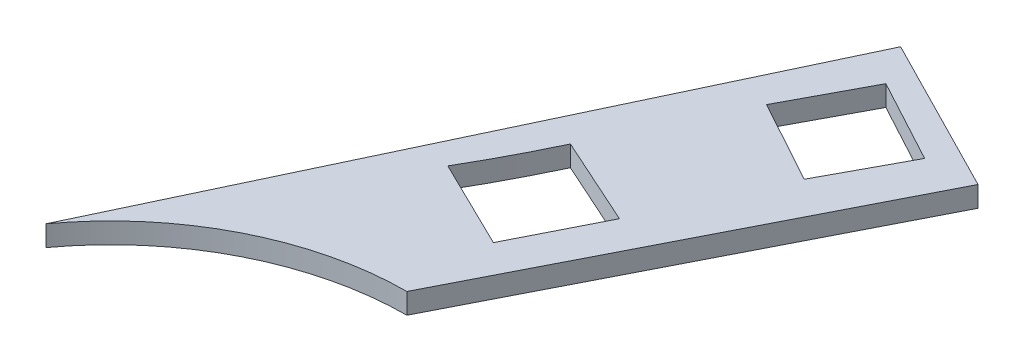
ISO-10303-21;
HEADER;
FILE_DESCRIPTION(('STEP AP214'),'2;1');
FILE_NAME('part.step','',(''),(''),'','','');
FILE_SCHEMA(('AUTOMOTIVE_DESIGN { 1 0 10303 214 1 1 1 1 }'));
ENDSEC;
DATA;
#1=APPLICATION_CONTEXT('core data for automotive mechanical design processes');
#2=APPLICATION_PROTOCOL_DEFINITION('international standard','automotive_design',2000,#1);
#3=PRODUCT_CONTEXT('',#1,'mechanical');
#4=PRODUCT('Part','Part','',(#3));
#5=PRODUCT_RELATED_PRODUCT_CATEGORY('part','',(#4));
#6=PRODUCT_DEFINITION_FORMATION('','',#4);
#7=PRODUCT_DEFINITION_CONTEXT('part definition',#1,'design');
#8=PRODUCT_DEFINITION('design','',#6,#7);
#9=PRODUCT_DEFINITION_SHAPE('','',#8);
#10=(LENGTH_UNIT() NAMED_UNIT(*) SI_UNIT(.MILLI.,.METRE.));
#11=(NAMED_UNIT(*) PLANE_ANGLE_UNIT() SI_UNIT($,.RADIAN.));
#12=(NAMED_UNIT(*) SI_UNIT($,.STERADIAN.) SOLID_ANGLE_UNIT());
#13=UNCERTAINTY_MEASURE_WITH_UNIT(LENGTH_MEASURE(1.E-05),#10,'distance_accuracy_value','');
#14=(GEOMETRIC_REPRESENTATION_CONTEXT(3) GLOBAL_UNCERTAINTY_ASSIGNED_CONTEXT((#13)) GLOBAL_UNIT_ASSIGNED_CONTEXT((#10,
#11,#12)) REPRESENTATION_CONTEXT('',''));
#15=CARTESIAN_POINT('',(0.,0.,0.));
#16=DIRECTION('',(0.,0.,1.));
#17=DIRECTION('',(1.,0.,0.));
#18=AXIS2_PLACEMENT_3D('',#15,#16,#17);
#19=CARTESIAN_POINT('',(-62.8289047130885,37.9982295849911,9.03251717554951));
#20=DIRECTION('',(0.,1.,0.));
#21=DIRECTION('',(0.,0.,1.));
#22=AXIS2_PLACEMENT_3D('',#19,#20,#21);
#23=CYLINDRICAL_SURFACE('',#22,40.1816629868308);
#24=DIRECTION('',(0.,1.,0.));
#25=VECTOR('',#24,1.);
#26=CARTESIAN_POINT('',(-62.9348275238655,37.9982295849911,-31.1490061995717));
#27=LINE('',#26,#25);
#28=CARTESIAN_POINT('',(-62.9348275238655,37.9982295849911,-31.1490061995717));
#29=VERTEX_POINT('',#28);
#30=CARTESIAN_POINT('',(-62.9348275238655,40.7893212700929,-31.1490061995717));
#31=VERTEX_POINT('',#30);
#32=EDGE_CURVE('E45',#29,#31,#27,.T.);
#33=ORIENTED_EDGE('',*,*,#32,.T.);
#34=CARTESIAN_POINT('',(-62.8289047130885,40.7893212700929,9.03251717554951));
#35=DIRECTION('',(0.,-1.,0.));
#36=DIRECTION('',(0.,0.,1.));
#37=AXIS2_PLACEMENT_3D('',#34,#35,#36);
#38=CIRCLE('',#37,40.1816629868308);
#39=CARTESIAN_POINT('',(-95.2854857466239,40.7893212700929,-14.6558003670875));
#40=VERTEX_POINT('',#39);
#41=EDGE_CURVE('E187',#40,#31,#38,.T.);
#42=ORIENTED_EDGE('',*,*,#41,.F.);
#43=DIRECTION('',(0.,1.,0.));
#44=VECTOR('',#43,1.);
#45=CARTESIAN_POINT('',(-95.2854857466239,37.9982295849911,-14.6558003670875));
#46=LINE('',#45,#44);
#47=CARTESIAN_POINT('',(-95.2854857466239,37.9982295849911,-14.6558003670875));
#48=VERTEX_POINT('',#47);
#49=EDGE_CURVE('E11',#48,#40,#46,.T.);
#50=ORIENTED_EDGE('',*,*,#49,.F.);
#51=CARTESIAN_POINT('',(-62.8289047130885,37.9982295849911,9.03251717554951));
#52=DIRECTION('',(0.,-1.,0.));
#53=DIRECTION('',(0.,0.,1.));
#54=AXIS2_PLACEMENT_3D('',#51,#52,#53);
#55=CIRCLE('',#54,40.1816629868308);
#56=EDGE_CURVE('E209',#48,#29,#55,.T.);
#57=ORIENTED_EDGE('',*,*,#56,.T.);
#58=EDGE_LOOP('',(#33,#42,#50,#57));
#59=FACE_BOUND('',#58,.T.);
#60=ADVANCED_FACE('F39',(#59),#23,.F.);
#61=CARTESIAN_POINT('',(-58.2065337706969,37.9982295849911,-93.2394391329269));
#62=DIRECTION('',(-0.904381861962965,0.,-0.426724088554186));
#63=DIRECTION('',(-0.426724088554186,0.,0.904381861962965));
#64=AXIS2_PLACEMENT_3D('',#61,#62,#63);
#65=PLANE('',#64);
#66=ORIENTED_EDGE('',*,*,#49,.T.);
#67=DIRECTION('',(-0.426724088554186,0.,0.904381861962965));
#68=VECTOR('',#67,1.);
#69=CARTESIAN_POINT('',(-58.2065337706969,40.7893212700929,-93.2394391329269));
#70=LINE('',#69,#68);
#71=CARTESIAN_POINT('',(-58.2065337706969,40.7893212700929,-93.2394391329269));
#72=VERTEX_POINT('',#71);
#73=EDGE_CURVE('E204',#72,#40,#70,.T.);
#74=ORIENTED_EDGE('',*,*,#73,.F.);
#75=DIRECTION('',(0.,1.,0.));
#76=VECTOR('',#75,1.);
#77=CARTESIAN_POINT('',(-58.2065337706969,37.9982295849911,-93.2394391329269));
#78=LINE('',#77,#76);
#79=CARTESIAN_POINT('',(-58.2065337706969,37.9982295849911,-93.2394391329269));
#80=VERTEX_POINT('',#79);
#81=EDGE_CURVE('E50',#80,#72,#78,.T.);
#82=ORIENTED_EDGE('',*,*,#81,.F.);
#83=DIRECTION('',(-0.426724088554186,0.,0.904381861962965));
#84=VECTOR('',#83,1.);
#85=CARTESIAN_POINT('',(-58.2065337706969,37.9982295849911,-93.2394391329269));
#86=LINE('',#85,#84);
#87=EDGE_CURVE('E220',#80,#48,#86,.T.);
#88=ORIENTED_EDGE('',*,*,#87,.T.);
#89=EDGE_LOOP('',(#66,#74,#82,#88));
#90=FACE_BOUND('',#89,.T.);
#91=ADVANCED_FACE('F231',(#90),#65,.T.);
#92=CARTESIAN_POINT('',(-36.8270195982419,37.9982295849911,-82.3345606948243));
#93=DIRECTION('',(0.45436993492094,0.,-0.89081309051896));
#94=DIRECTION('',(-0.89081309051896,0.,-0.454369934920939));
#95=AXIS2_PLACEMENT_3D('',#92,#93,#94);
#96=PLANE('',#95);
#97=ORIENTED_EDGE('',*,*,#81,.T.);
#98=DIRECTION('',(-0.89081309051896,0.,-0.454369934920939));
#99=VECTOR('',#98,1.);
#100=CARTESIAN_POINT('',(-36.8270195982419,40.7893212700929,-82.3345606948243));
#101=LINE('',#100,#99);
#102=CARTESIAN_POINT('',(-36.8270195982419,40.7893212700929,-82.3345606948243));
#103=VERTEX_POINT('',#102);
#104=EDGE_CURVE('E205',#103,#72,#101,.T.);
#105=ORIENTED_EDGE('',*,*,#104,.F.);
#106=DIRECTION('',(0.,1.,0.));
#107=VECTOR('',#106,1.);
#108=CARTESIAN_POINT('',(-36.8270195982419,37.9982295849911,-82.3345606948243));
#109=LINE('',#108,#107);
#110=CARTESIAN_POINT('',(-36.8270195982419,37.9982295849911,-82.3345606948243));
#111=VERTEX_POINT('',#110);
#112=EDGE_CURVE('E216',#111,#103,#109,.T.);
#113=ORIENTED_EDGE('',*,*,#112,.F.);
#114=DIRECTION('',(-0.89081309051896,0.,-0.454369934920939));
#115=VECTOR('',#114,1.);
#116=CARTESIAN_POINT('',(-36.8270195982419,37.9982295849911,-82.3345606948243));
#117=LINE('',#116,#115);
#118=EDGE_CURVE('E211',#111,#80,#117,.T.);
#119=ORIENTED_EDGE('',*,*,#118,.T.);
#120=EDGE_LOOP('',(#97,#105,#113,#119));
#121=FACE_BOUND('',#120,.T.);
#122=ADVANCED_FACE('F239',(#121),#96,.T.);
#123=CARTESIAN_POINT('',(-62.9348275238655,37.9982295849911,-31.1490061995717));
#124=DIRECTION('',(0.89081309051896,0.,0.454369934920939));
#125=DIRECTION('',(0.45436993492094,0.,-0.89081309051896));
#126=AXIS2_PLACEMENT_3D('',#123,#124,#125);
#127=PLANE('',#126);
#128=ORIENTED_EDGE('',*,*,#112,.T.);
#129=DIRECTION('',(0.45436993492094,0.,-0.89081309051896));
#130=VECTOR('',#129,1.);
#131=CARTESIAN_POINT('',(-62.9348275238655,40.7893212700929,-31.1490061995717));
#132=LINE('',#131,#130);
#133=EDGE_CURVE('E197',#31,#103,#132,.T.);
#134=ORIENTED_EDGE('',*,*,#133,.F.);
#135=ORIENTED_EDGE('',*,*,#32,.F.);
#136=DIRECTION('',(0.45436993492094,0.,-0.89081309051896));
#137=VECTOR('',#136,1.);
#138=CARTESIAN_POINT('',(-62.9348275238655,37.9982295849911,-31.1490061995717));
#139=LINE('',#138,#137);
#140=EDGE_CURVE('E212',#29,#111,#139,.T.);
#141=ORIENTED_EDGE('',*,*,#140,.T.);
#142=EDGE_LOOP('',(#128,#134,#135,#141));
#143=FACE_BOUND('',#142,.T.);
#144=ADVANCED_FACE('F230',(#143),#127,.T.);
#145=CARTESIAN_POINT('',(-62.8289047130885,37.9982295849911,9.03251717554951));
#146=DIRECTION('',(0.,1.,0.));
#147=DIRECTION('',(0.,0.,1.));
#148=AXIS2_PLACEMENT_3D('',#145,#146,#147);
#149=PLANE('',#148);
#150=DIRECTION('',(-0.911701732472902,0.,-0.410852712058604));
#151=VECTOR('',#150,1.);
#152=CARTESIAN_POINT('',(-69.158084260027,37.9982295849911,-59.5031231779195));
#153=LINE('',#152,#151);
#154=CARTESIAN_POINT('',(-57.0791117821558,37.9982295849911,-54.059809400338));
#155=VERTEX_POINT('',#154);
#156=CARTESIAN_POINT('',(-69.158084260027,37.9982295849911,-59.5031231779195));
#157=VERTEX_POINT('',#156);
#158=EDGE_CURVE('E137',#155,#157,#153,.T.);
#159=ORIENTED_EDGE('',*,*,#158,.T.);
#160=CARTESIAN_POINT('',(-194.032304390322,37.9982295849911,-118.320701651241));
#161=DIRECTION('',(0.,-1.,0.));
#162=DIRECTION('',(0.,0.,1.));
#163=AXIS2_PLACEMENT_3D('',#160,#161,#162);
#164=CIRCLE('',#163,138.032888800512);
#165=CARTESIAN_POINT('',(-74.8832682343405,37.9982295849911,-48.6314946410066));
#166=VERTEX_POINT('',#165);
#167=EDGE_CURVE('E129',#157,#166,#164,.T.);
#168=ORIENTED_EDGE('',*,*,#167,.T.);
#169=DIRECTION('',(0.898326857459229,0.,0.439327733209988));
#170=VECTOR('',#169,1.);
#171=CARTESIAN_POINT('',(-62.8058048445968,37.9982295849911,-42.7249979467524));
#172=LINE('',#171,#170);
#173=CARTESIAN_POINT('',(-62.8058048445968,37.9982295849911,-42.7249979467524));
#174=VERTEX_POINT('',#173);
#175=EDGE_CURVE('E136',#166,#174,#172,.T.);
#176=ORIENTED_EDGE('',*,*,#175,.T.);
#177=DIRECTION('',(0.450944529189245,0.,-0.892551976970692));
#178=VECTOR('',#177,1.);
#179=CARTESIAN_POINT('',(-57.0791117821558,37.9982295849911,-54.059809400338));
#180=LINE('',#179,#178);
#181=EDGE_CURVE('E54',#174,#155,#180,.T.);
#182=ORIENTED_EDGE('',*,*,#181,.T.);
#183=EDGE_LOOP('',(#159,#168,#176,#182));
#184=FACE_BOUND('',#183,.T.);
#185=DIRECTION('',(-0.880219538244176,0.,-0.47456671237373));
#186=VECTOR('',#185,1.);
#187=CARTESIAN_POINT('',(-43.491580171523,37.9982295849911,-81.7775232192609));
#188=LINE('',#187,#186);
#189=CARTESIAN_POINT('',(-43.491580171523,37.9982295849911,-81.7775232192609));
#190=VERTEX_POINT('',#189);
#191=CARTESIAN_POINT('',(-54.8781589667851,37.9982295849911,-87.9165499384712));
#192=VERTEX_POINT('',#191);
#193=EDGE_CURVE('E174',#190,#192,#188,.T.);
#194=ORIENTED_EDGE('',*,*,#193,.T.);
#195=DIRECTION('',(-0.470769339573196,0.,0.882256328352377));
#196=VECTOR('',#195,1.);
#197=CARTESIAN_POINT('',(-60.4974534943423,37.9982295849911,-77.3855791613433));
#198=LINE('',#197,#196);
#199=CARTESIAN_POINT('',(-60.4974534943423,37.9982295849911,-77.3855791613433));
#200=VERTEX_POINT('',#199);
#201=EDGE_CURVE('E163',#192,#200,#198,.T.);
#202=ORIENTED_EDGE('',*,*,#201,.T.);
#203=DIRECTION('',(0.876722413392075,0.,0.480996683830539));
#204=VECTOR('',#203,1.);
#205=CARTESIAN_POINT('',(-60.4974534943423,37.9982295849911,-77.3855791613433));
#206=LINE('',#205,#204);
#207=CARTESIAN_POINT('',(-49.1985903915484,37.9982295849911,-71.1866778894208));
#208=VERTEX_POINT('',#207);
#209=EDGE_CURVE('E168',#200,#208,#206,.T.);
#210=ORIENTED_EDGE('',*,*,#209,.T.);
#211=DIRECTION('',(0.474373490825997,0.,-0.880323685471178));
#212=VECTOR('',#211,1.);
#213=CARTESIAN_POINT('',(-49.1985903915484,37.9982295849911,-71.1866778894208));
#214=LINE('',#213,#212);
#215=EDGE_CURVE('E175',#208,#190,#214,.T.);
#216=ORIENTED_EDGE('',*,*,#215,.T.);
#217=EDGE_LOOP('',(#194,#202,#210,#216));
#218=FACE_BOUND('',#217,.T.);
#219=ORIENTED_EDGE('',*,*,#56,.F.);
#220=ORIENTED_EDGE('',*,*,#87,.F.);
#221=ORIENTED_EDGE('',*,*,#118,.F.);
#222=ORIENTED_EDGE('',*,*,#140,.F.);
#223=EDGE_LOOP('',(#219,#220,#221,#222));
#224=FACE_BOUND('',#223,.T.);
#225=ADVANCED_FACE('F143',(#184,#218,#224),#149,.F.);
#226=CARTESIAN_POINT('',(-62.8289047130885,40.7893212700929,9.03251717554951));
#227=DIRECTION('',(0.,1.,0.));
#228=DIRECTION('',(0.,0.,1.));
#229=AXIS2_PLACEMENT_3D('',#226,#227,#228);
#230=PLANE('',#229);
#231=CARTESIAN_POINT('',(-194.032304390322,40.7893212700929,-118.320701651241));
#232=DIRECTION('',(0.,-1.,0.));
#233=DIRECTION('',(0.,0.,1.));
#234=AXIS2_PLACEMENT_3D('',#231,#232,#233);
#235=CIRCLE('',#234,138.032888800512);
#236=CARTESIAN_POINT('',(-69.158084260027,40.7893212700929,-59.5031231779195));
#237=VERTEX_POINT('',#236);
#238=CARTESIAN_POINT('',(-74.8832682343405,40.7893212700929,-48.6314946410066));
#239=VERTEX_POINT('',#238);
#240=EDGE_CURVE('E64',#237,#239,#235,.T.);
#241=ORIENTED_EDGE('',*,*,#240,.F.);
#242=DIRECTION('',(-0.911701732472902,0.,-0.410852712058604));
#243=VECTOR('',#242,1.);
#244=CARTESIAN_POINT('',(-69.158084260027,40.7893212700929,-59.5031231779195));
#245=LINE('',#244,#243);
#246=CARTESIAN_POINT('',(-57.0791117821558,40.7893212700929,-54.059809400338));
#247=VERTEX_POINT('',#246);
#248=EDGE_CURVE('E148',#247,#237,#245,.T.);
#249=ORIENTED_EDGE('',*,*,#248,.F.);
#250=DIRECTION('',(0.450944529189245,0.,-0.892551976970692));
#251=VECTOR('',#250,1.);
#252=CARTESIAN_POINT('',(-57.0791117821558,40.7893212700929,-54.059809400338));
#253=LINE('',#252,#251);
#254=CARTESIAN_POINT('',(-62.8058048445968,40.7893212700929,-42.7249979467524));
#255=VERTEX_POINT('',#254);
#256=EDGE_CURVE('E147',#255,#247,#253,.T.);
#257=ORIENTED_EDGE('',*,*,#256,.F.);
#258=DIRECTION('',(0.898326857459229,0.,0.439327733209988));
#259=VECTOR('',#258,1.);
#260=CARTESIAN_POINT('',(-62.8058048445968,40.7893212700929,-42.7249979467524));
#261=LINE('',#260,#259);
#262=EDGE_CURVE('E151',#239,#255,#261,.T.);
#263=ORIENTED_EDGE('',*,*,#262,.F.);
#264=EDGE_LOOP('',(#241,#249,#257,#263));
#265=FACE_BOUND('',#264,.T.);
#266=DIRECTION('',(-0.470769339573196,0.,0.882256328352377));
#267=VECTOR('',#266,1.);
#268=CARTESIAN_POINT('',(-60.4974534943423,40.7893212700929,-77.3855791613433));
#269=LINE('',#268,#267);
#270=CARTESIAN_POINT('',(-54.8781589667851,40.7893212700929,-87.9165499384712));
#271=VERTEX_POINT('',#270);
#272=CARTESIAN_POINT('',(-60.4974534943423,40.7893212700929,-77.3855791613433));
#273=VERTEX_POINT('',#272);
#274=EDGE_CURVE('E162',#271,#273,#269,.T.);
#275=ORIENTED_EDGE('',*,*,#274,.F.);
#276=DIRECTION('',(-0.880219538244176,0.,-0.47456671237373));
#277=VECTOR('',#276,1.);
#278=CARTESIAN_POINT('',(-43.491580171523,40.7893212700929,-81.7775232192609));
#279=LINE('',#278,#277);
#280=CARTESIAN_POINT('',(-43.491580171523,40.7893212700929,-81.7775232192609));
#281=VERTEX_POINT('',#280);
#282=EDGE_CURVE('E169',#281,#271,#279,.T.);
#283=ORIENTED_EDGE('',*,*,#282,.F.);
#284=DIRECTION('',(0.474373490825997,0.,-0.880323685471178));
#285=VECTOR('',#284,1.);
#286=CARTESIAN_POINT('',(-49.1985903915484,40.7893212700929,-71.1866778894208));
#287=LINE('',#286,#285);
#288=CARTESIAN_POINT('',(-49.1985903915484,40.7893212700929,-71.1866778894208));
#289=VERTEX_POINT('',#288);
#290=EDGE_CURVE('E181',#289,#281,#287,.T.);
#291=ORIENTED_EDGE('',*,*,#290,.F.);
#292=DIRECTION('',(0.876722413392075,0.,0.480996683830539));
#293=VECTOR('',#292,1.);
#294=CARTESIAN_POINT('',(-60.4974534943423,40.7893212700929,-77.3855791613433));
#295=LINE('',#294,#293);
#296=EDGE_CURVE('E179',#273,#289,#295,.T.);
#297=ORIENTED_EDGE('',*,*,#296,.F.);
#298=EDGE_LOOP('',(#275,#283,#291,#297));
#299=FACE_BOUND('',#298,.T.);
#300=ORIENTED_EDGE('',*,*,#41,.T.);
#301=ORIENTED_EDGE('',*,*,#133,.T.);
#302=ORIENTED_EDGE('',*,*,#104,.T.);
#303=ORIENTED_EDGE('',*,*,#73,.T.);
#304=EDGE_LOOP('',(#300,#301,#302,#303));
#305=FACE_BOUND('',#304,.T.);
#306=ADVANCED_FACE('F226',(#265,#299,#305),#230,.T.);
#307=CARTESIAN_POINT('',(-60.4974534943423,37.9982295849911,-77.3855791613433));
#308=DIRECTION('',(-0.882256328352377,0.,-0.470769339573196));
#309=DIRECTION('',(-0.470769339573196,0.,0.882256328352377));
#310=AXIS2_PLACEMENT_3D('',#307,#308,#309);
#311=PLANE('',#310);
#312=ORIENTED_EDGE('',*,*,#274,.T.);
#313=DIRECTION('',(0.,1.,0.));
#314=VECTOR('',#313,1.);
#315=CARTESIAN_POINT('',(-60.4974534943423,37.9982295849911,-77.3855791613433));
#316=LINE('',#315,#314);
#317=EDGE_CURVE('E176',#200,#273,#316,.T.);
#318=ORIENTED_EDGE('',*,*,#317,.F.);
#319=ORIENTED_EDGE('',*,*,#201,.F.);
#320=DIRECTION('',(0.,1.,0.));
#321=VECTOR('',#320,1.);
#322=CARTESIAN_POINT('',(-54.8781589667851,37.9982295849911,-87.9165499384712));
#323=LINE('',#322,#321);
#324=EDGE_CURVE('E186',#192,#271,#323,.T.);
#325=ORIENTED_EDGE('',*,*,#324,.T.);
#326=EDGE_LOOP('',(#312,#318,#319,#325));
#327=FACE_BOUND('',#326,.T.);
#328=ADVANCED_FACE('F281',(#327),#311,.F.);
#329=CARTESIAN_POINT('',(-43.491580171523,37.9982295849911,-81.7775232192609));
#330=DIRECTION('',(0.47456671237373,0.,-0.880219538244176));
#331=DIRECTION('',(-0.880219538244176,0.,-0.47456671237373));
#332=AXIS2_PLACEMENT_3D('',#329,#330,#331);
#333=PLANE('',#332);
#334=ORIENTED_EDGE('',*,*,#282,.T.);
#335=ORIENTED_EDGE('',*,*,#324,.F.);
#336=ORIENTED_EDGE('',*,*,#193,.F.);
#337=DIRECTION('',(0.,1.,0.));
#338=VECTOR('',#337,1.);
#339=CARTESIAN_POINT('',(-43.491580171523,37.9982295849911,-81.7775232192609));
#340=LINE('',#339,#338);
#341=EDGE_CURVE('E191',#190,#281,#340,.T.);
#342=ORIENTED_EDGE('',*,*,#341,.T.);
#343=EDGE_LOOP('',(#334,#335,#336,#342));
#344=FACE_BOUND('',#343,.T.);
#345=ADVANCED_FACE('F294',(#344),#333,.F.);
#346=CARTESIAN_POINT('',(-49.1985903915484,37.9982295849911,-71.1866778894208));
#347=DIRECTION('',(0.880323685471178,0.,0.474373490825997));
#348=DIRECTION('',(0.474373490825997,0.,-0.880323685471178));
#349=AXIS2_PLACEMENT_3D('',#346,#347,#348);
#350=PLANE('',#349);
#351=ORIENTED_EDGE('',*,*,#290,.T.);
#352=ORIENTED_EDGE('',*,*,#341,.F.);
#353=ORIENTED_EDGE('',*,*,#215,.F.);
#354=DIRECTION('',(0.,1.,0.));
#355=VECTOR('',#354,1.);
#356=CARTESIAN_POINT('',(-49.1985903915484,37.9982295849911,-71.1866778894208));
#357=LINE('',#356,#355);
#358=EDGE_CURVE('E193',#208,#289,#357,.T.);
#359=ORIENTED_EDGE('',*,*,#358,.T.);
#360=EDGE_LOOP('',(#351,#352,#353,#359));
#361=FACE_BOUND('',#360,.T.);
#362=ADVANCED_FACE('F304',(#361),#350,.F.);
#363=CARTESIAN_POINT('',(-60.4974534943423,37.9982295849911,-77.3855791613433));
#364=DIRECTION('',(-0.480996683830539,0.,0.876722413392075));
#365=DIRECTION('',(0.876722413392075,0.,0.480996683830539));
#366=AXIS2_PLACEMENT_3D('',#363,#364,#365);
#367=PLANE('',#366);
#368=ORIENTED_EDGE('',*,*,#296,.T.);
#369=ORIENTED_EDGE('',*,*,#358,.F.);
#370=ORIENTED_EDGE('',*,*,#209,.F.);
#371=ORIENTED_EDGE('',*,*,#317,.T.);
#372=EDGE_LOOP('',(#368,#369,#370,#371));
#373=FACE_BOUND('',#372,.T.);
#374=ADVANCED_FACE('F311',(#373),#367,.F.);
#375=CARTESIAN_POINT('',(-194.032304390322,37.9982295849911,-118.320701651241));
#376=DIRECTION('',(0.,1.,0.));
#377=DIRECTION('',(0.,0.,1.));
#378=AXIS2_PLACEMENT_3D('',#375,#376,#377);
#379=CYLINDRICAL_SURFACE('',#378,138.032888800512);
#380=ORIENTED_EDGE('',*,*,#240,.T.);
#381=DIRECTION('',(0.,1.,0.));
#382=VECTOR('',#381,1.);
#383=CARTESIAN_POINT('',(-74.8832682343405,37.9982295849911,-48.6314946410066));
#384=LINE('',#383,#382);
#385=EDGE_CURVE('E126',#166,#239,#384,.T.);
#386=ORIENTED_EDGE('',*,*,#385,.F.);
#387=ORIENTED_EDGE('',*,*,#167,.F.);
#388=DIRECTION('',(0.,1.,0.));
#389=VECTOR('',#388,1.);
#390=CARTESIAN_POINT('',(-69.158084260027,37.9982295849911,-59.5031231779195));
#391=LINE('',#390,#389);
#392=EDGE_CURVE('E159',#157,#237,#391,.T.);
#393=ORIENTED_EDGE('',*,*,#392,.T.);
#394=EDGE_LOOP('',(#380,#386,#387,#393));
#395=FACE_BOUND('',#394,.T.);
#396=ADVANCED_FACE('F127',(#395),#379,.T.);
#397=CARTESIAN_POINT('',(-69.158084260027,37.9982295849911,-59.5031231779195));
#398=DIRECTION('',(0.410852712058604,0.,-0.911701732472902));
#399=DIRECTION('',(-0.911701732472902,0.,-0.410852712058604));
#400=AXIS2_PLACEMENT_3D('',#397,#398,#399);
#401=PLANE('',#400);
#402=ORIENTED_EDGE('',*,*,#248,.T.);
#403=ORIENTED_EDGE('',*,*,#392,.F.);
#404=ORIENTED_EDGE('',*,*,#158,.F.);
#405=DIRECTION('',(0.,1.,0.));
#406=VECTOR('',#405,1.);
#407=CARTESIAN_POINT('',(-57.0791117821558,37.9982295849911,-54.059809400338));
#408=LINE('',#407,#406);
#409=EDGE_CURVE('E165',#155,#247,#408,.T.);
#410=ORIENTED_EDGE('',*,*,#409,.T.);
#411=EDGE_LOOP('',(#402,#403,#404,#410));
#412=FACE_BOUND('',#411,.T.);
#413=ADVANCED_FACE('F333',(#412),#401,.F.);
#414=CARTESIAN_POINT('',(-57.0791117821558,37.9982295849911,-54.059809400338));
#415=DIRECTION('',(0.892551976970692,0.,0.450944529189245));
#416=DIRECTION('',(0.450944529189245,0.,-0.892551976970692));
#417=AXIS2_PLACEMENT_3D('',#414,#415,#416);
#418=PLANE('',#417);
#419=ORIENTED_EDGE('',*,*,#256,.T.);
#420=ORIENTED_EDGE('',*,*,#409,.F.);
#421=ORIENTED_EDGE('',*,*,#181,.F.);
#422=DIRECTION('',(0.,1.,0.));
#423=VECTOR('',#422,1.);
#424=CARTESIAN_POINT('',(-62.8058048445968,37.9982295849911,-42.7249979467524));
#425=LINE('',#424,#423);
#426=EDGE_CURVE('E133',#174,#255,#425,.T.);
#427=ORIENTED_EDGE('',*,*,#426,.T.);
#428=EDGE_LOOP('',(#419,#420,#421,#427));
#429=FACE_BOUND('',#428,.T.);
#430=ADVANCED_FACE('F337',(#429),#418,.F.);
#431=CARTESIAN_POINT('',(-62.8058048445968,37.9982295849911,-42.7249979467524));
#432=DIRECTION('',(-0.439327733209988,0.,0.898326857459229));
#433=DIRECTION('',(0.898326857459229,0.,0.439327733209988));
#434=AXIS2_PLACEMENT_3D('',#431,#432,#433);
#435=PLANE('',#434);
#436=ORIENTED_EDGE('',*,*,#262,.T.);
#437=ORIENTED_EDGE('',*,*,#426,.F.);
#438=ORIENTED_EDGE('',*,*,#175,.F.);
#439=ORIENTED_EDGE('',*,*,#385,.T.);
#440=EDGE_LOOP('',(#436,#437,#438,#439));
#441=FACE_BOUND('',#440,.T.);
#442=ADVANCED_FACE('F138',(#441),#435,.F.);
#443=CLOSED_SHELL('',(#60,#91,#122,#144,#225,#306,#328,#345,#362,#374,#396,#413,#430,#442));
#444=MANIFOLD_SOLID_BREP('B2',#443);
#445=ADVANCED_BREP_SHAPE_REPRESENTATION('',(#18,#444),#14);
#446=SHAPE_DEFINITION_REPRESENTATION(#9,#445);
ENDSEC;
END-ISO-10303-21;
